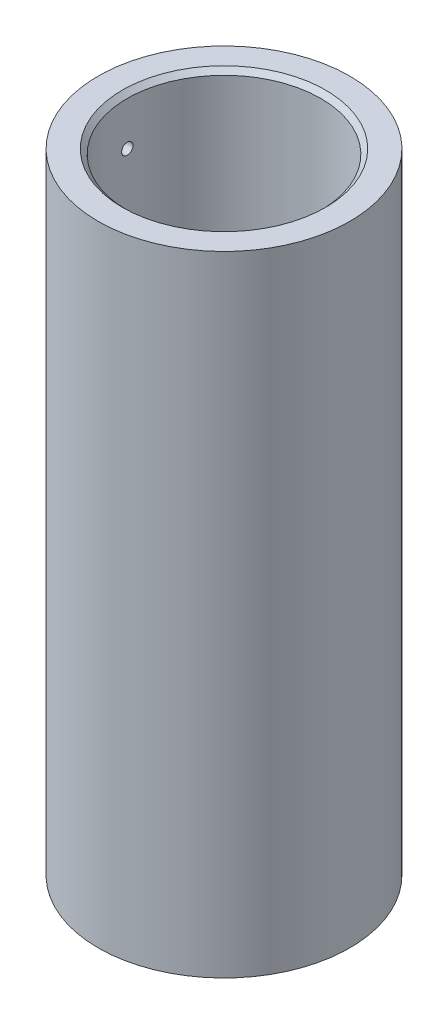
ISO-10303-21;
HEADER;
FILE_DESCRIPTION(('STEP AP214'),'2;1');
FILE_NAME('part.step','',(''),(''),'','','');
FILE_SCHEMA(('AUTOMOTIVE_DESIGN { 1 0 10303 214 1 1 1 1 }'));
ENDSEC;
DATA;
#1=APPLICATION_CONTEXT('core data for automotive mechanical design processes');
#2=APPLICATION_PROTOCOL_DEFINITION('international standard','automotive_design',2000,#1);
#3=PRODUCT_CONTEXT('',#1,'mechanical');
#4=PRODUCT('Part','Part','',(#3));
#5=PRODUCT_RELATED_PRODUCT_CATEGORY('part','',(#4));
#6=PRODUCT_DEFINITION_FORMATION('','',#4);
#7=PRODUCT_DEFINITION_CONTEXT('part definition',#1,'design');
#8=PRODUCT_DEFINITION('design','',#6,#7);
#9=PRODUCT_DEFINITION_SHAPE('','',#8);
#10=(LENGTH_UNIT() NAMED_UNIT(*) SI_UNIT(.MILLI.,.METRE.));
#11=(NAMED_UNIT(*) PLANE_ANGLE_UNIT() SI_UNIT($,.RADIAN.));
#12=(NAMED_UNIT(*) SI_UNIT($,.STERADIAN.) SOLID_ANGLE_UNIT());
#13=UNCERTAINTY_MEASURE_WITH_UNIT(LENGTH_MEASURE(1.E-05),#10,'distance_accuracy_value','');
#14=(GEOMETRIC_REPRESENTATION_CONTEXT(3) GLOBAL_UNCERTAINTY_ASSIGNED_CONTEXT((#13)) GLOBAL_UNIT_ASSIGNED_CONTEXT((#10,
#11,#12)) REPRESENTATION_CONTEXT('',''));
#15=CARTESIAN_POINT('',(0.,0.,0.));
#16=DIRECTION('',(0.,0.,1.));
#17=DIRECTION('',(1.,0.,0.));
#18=AXIS2_PLACEMENT_3D('',#15,#16,#17);
#19=CARTESIAN_POINT('',(0.,65.,0.));
#20=DIRECTION('',(0.,-1.,0.));
#21=DIRECTION('',(0.,0.,-1.));
#22=AXIS2_PLACEMENT_3D('',#19,#20,#21);
#23=CYLINDRICAL_SURFACE('',#22,13.);
#24=CARTESIAN_POINT('',(0.,65.,0.));
#25=DIRECTION('',(0.,1.,0.));
#26=DIRECTION('',(0.,0.,1.));
#27=AXIS2_PLACEMENT_3D('',#24,#25,#26);
#28=CIRCLE('',#27,13.);
#29=CARTESIAN_POINT('',(0.,65.,13.));
#30=VERTEX_POINT('',#29);
#31=EDGE_CURVE('E116',#30,#30,#28,.T.);
#32=ORIENTED_EDGE('',*,*,#31,.F.);
#33=EDGE_LOOP('',(#32));
#34=FACE_BOUND('',#33,.T.);
#35=CARTESIAN_POINT('',(0.,0.,0.));
#36=DIRECTION('',(0.,1.,0.));
#37=DIRECTION('',(0.,0.,1.));
#38=AXIS2_PLACEMENT_3D('',#35,#36,#37);
#39=CIRCLE('',#38,13.);
#40=CARTESIAN_POINT('',(0.,0.,13.));
#41=VERTEX_POINT('',#40);
#42=EDGE_CURVE('E71',#41,#41,#39,.T.);
#43=ORIENTED_EDGE('',*,*,#42,.T.);
#44=EDGE_LOOP('',(#43));
#45=FACE_BOUND('',#44,.T.);
#46=CARTESIAN_POINT('',(-12.9826052190465,59.3392387092506,-0.672281797011985));
#47=CARTESIAN_POINT('',(-12.984748886898,59.2960091721407,-0.630881430459776));
#48=CARTESIAN_POINT('',(-12.986909916261,59.2566726187457,-0.585299325584049));
#49=CARTESIAN_POINT('',(-12.9909521751454,59.1873786897514,-0.487398756726515));
#50=CARTESIAN_POINT('',(-12.9928329540857,59.1574363343137,-0.435069691745123));
#51=CARTESIAN_POINT('',(-12.995842561365,59.1111442011382,-0.332255636643755));
#52=CARTESIAN_POINT('',(-12.9970348033501,59.093588874855,-0.282312356670873));
#53=CARTESIAN_POINT('',(-12.9988512134006,59.0672302674987,-0.180191926650553));
#54=CARTESIAN_POINT('',(-12.9994758392139,59.0584199335904,-0.128016612224583));
#55=CARTESIAN_POINT('',(-13.0000821145129,59.049866262531,-0.0235968489868751));
#56=CARTESIAN_POINT('',(-13.000071853043,59.0500088572308,0.0286382530391472));
#57=CARTESIAN_POINT('',(-12.9994297794527,59.059072145411,0.132342683722056));
#58=CARTESIAN_POINT('',(-12.9987979097877,59.0679936515887,0.183811941033973));
#59=CARTESIAN_POINT('',(-12.9969869075833,59.0942944512943,0.284345877573625));
#60=CARTESIAN_POINT('',(-12.9958096014869,59.1116455270085,0.33341798228144));
#61=CARTESIAN_POINT('',(-12.993039448689,59.1542658270955,0.427978791938771));
#62=CARTESIAN_POINT('',(-12.9914465929942,59.1795352228377,0.473467419307547));
#63=CARTESIAN_POINT('',(-12.9880070713529,59.237473910249,0.559967369413155));
#64=CARTESIAN_POINT('',(-12.9861585078854,59.2701998339126,0.600940668060977));
#65=CARTESIAN_POINT('',(-12.9824211564049,59.341985828498,0.676897436562798));
#66=CARTESIAN_POINT('',(-12.9805323658362,59.3810463029295,0.711880524549636));
#67=CARTESIAN_POINT('',(-12.9768964381306,59.4649551708922,0.775361939128481));
#68=CARTESIAN_POINT('',(-12.9751515271372,59.5098738332754,0.803767519434379));
#69=CARTESIAN_POINT('',(-12.972025347655,59.6038103916964,0.852738511707706));
#70=CARTESIAN_POINT('',(-12.9706441019371,59.6528285441713,0.873303432766921));
#71=CARTESIAN_POINT('',(-12.9683849462962,59.7541604968562,0.906239237758916));
#72=CARTESIAN_POINT('',(-12.9675128036119,59.8065048806641,0.918516471625239));
#73=CARTESIAN_POINT('',(-12.9663937192655,59.9125141301852,0.934182226617728));
#74=CARTESIAN_POINT('',(-12.9661467993814,59.9661790418298,0.937570438117909));
#75=CARTESIAN_POINT('',(-12.9663062811821,60.0736118082706,0.935362349022701));
#76=CARTESIAN_POINT('',(-12.9667161904529,60.1273786740147,0.929717812135636));
#77=CARTESIAN_POINT('',(-12.9681496418824,60.2332003234051,0.909503290001022));
#78=CARTESIAN_POINT('',(-12.9691731924612,60.2852550835481,0.894933182279924));
#79=CARTESIAN_POINT('',(-12.97171773408,60.3861602623707,0.857259141025642));
#80=CARTESIAN_POINT('',(-12.9732386628092,60.4350110815161,0.834156276418472));
#81=CARTESIAN_POINT('',(-12.9766047772673,60.5281037411614,0.780038705166259));
#82=CARTESIAN_POINT('',(-12.9784499573952,60.5723456612544,0.749024135183669));
#83=CARTESIAN_POINT('',(-12.9822418147528,60.6546801142608,0.680130436612937));
#84=CARTESIAN_POINT('',(-12.9841878492142,60.6928064585135,0.642291695999673));
#85=CARTESIAN_POINT('',(-12.9879676987646,60.7620732566609,0.560678043420841));
#86=CARTESIAN_POINT('',(-12.9898015208197,60.793214144522,0.516903500483939));
#87=CARTESIAN_POINT('',(-12.9931245521981,60.847235445564,0.425196832267299));
#88=CARTESIAN_POINT('',(-12.994617514577,60.8702075475027,0.377318864757513));
#89=CARTESIAN_POINT('',(-12.9971140278697,60.907676603243,0.278342196006524));
#90=CARTESIAN_POINT('',(-12.9981176204354,60.922174278353,0.227243769287835));
#91=CARTESIAN_POINT('',(-12.9995096525294,60.9421015739563,0.124006384453683));
#92=CARTESIAN_POINT('',(-12.9999060920773,60.9476491762071,0.0718902879363762));
#93=CARTESIAN_POINT('',(-13.000064115705,60.9498722774745,-0.0325304797689752));
#94=CARTESIAN_POINT('',(-12.9998257314637,60.9465482192028,-0.0848351414172111));
#95=CARTESIAN_POINT('',(-12.9987450389048,60.9311860028407,-0.187778135906221));
#96=CARTESIAN_POINT('',(-12.9979068200459,60.9192068468139,-0.238425336671414));
#97=CARTESIAN_POINT('',(-12.9957248387833,60.8869691654905,-0.336999015964268));
#98=CARTESIAN_POINT('',(-12.9943810697892,60.8667105322599,-0.384925459013958));
#99=CARTESIAN_POINT('',(-12.9913298740764,60.818411639011,-0.476948552136245));
#100=CARTESIAN_POINT('',(-12.9896208061837,60.790336081741,-0.521026610144796));
#101=CARTESIAN_POINT('',(-12.9860314713562,60.7272703504657,-0.603912836290987));
#102=CARTESIAN_POINT('',(-12.984151193675,60.6922797422576,-0.642720673248021));
#103=CARTESIAN_POINT('',(-12.980401305209,60.6159087979467,-0.714487419975045));
#104=CARTESIAN_POINT('',(-12.9785321206729,60.5744541418139,-0.747367258629224));
#105=CARTESIAN_POINT('',(-12.9750351616416,60.4866619881795,-0.805805405531395));
#106=CARTESIAN_POINT('',(-12.9734074038586,60.4403241530339,-0.831363207047218));
#107=CARTESIAN_POINT('',(-12.9705540706945,60.343454629107,-0.874761977332898));
#108=CARTESIAN_POINT('',(-12.9693337811142,60.2928777287729,-0.892502413354063));
#109=CARTESIAN_POINT('',(-12.9674601145576,60.1894707598804,-0.919326060707889));
#110=CARTESIAN_POINT('',(-12.9668067310369,60.136640717339,-0.928409371976373));
#111=CARTESIAN_POINT('',(-12.9661371769876,60.0298215704677,-0.937715028054261));
#112=CARTESIAN_POINT('',(-12.9661255801365,59.975826889543,-0.937873772272528));
#113=CARTESIAN_POINT('',(-12.9667527240928,59.8685533925895,-0.92916207568068));
#114=CARTESIAN_POINT('',(-12.9673917022578,59.8152748450249,-0.920288339435559));
#115=CARTESIAN_POINT('',(-12.9692499133937,59.7108549475514,-0.893718743423222));
#116=CARTESIAN_POINT('',(-12.970470430786,59.6597186023527,-0.876003351327462));
#117=CARTESIAN_POINT('',(-12.9733522276785,59.5612330782097,-0.83223138393686));
#118=CARTESIAN_POINT('',(-12.9750127714517,59.5138777477987,-0.806188717017536));
#119=CARTESIAN_POINT('',(-12.9777183585392,59.4459873297297,-0.760961395619876));
#120=CARTESIAN_POINT('',(-12.978672720714,59.4235566753345,-0.744550546743418));
#121=CARTESIAN_POINT('',(-12.980618540075,59.3802169144847,-0.709821222200196));
#122=CARTESIAN_POINT('',(-12.9816100085666,59.3593082775585,-0.69150216206884));
#123=CARTESIAN_POINT('',(-12.9826052190465,59.3392387092506,-0.672281797011985));
#124=B_SPLINE_CURVE_WITH_KNOTS('',3,(#46,#47,#48,#49,#50,#51,#52,#53,#54,#55,#56,#57,#58,#59,
#60,#61,#62,#63,#64,#65,#66,#67,#68,#69,#70,#71,#72,#73,#74,#75,#76,#77,#78,#79,#80,#81,#82,#83,
#84,#85,#86,#87,#88,#89,#90,#91,#92,#93,#94,#95,#96,#97,#98,#99,#100,#101,#102,#103,#104,#105,
#106,#107,#108,#109,#110,#111,#112,#113,#114,#115,#116,#117,#118,#119,#120,#121,#122,#123),
.UNSPECIFIED.,.T.,.F.,(4,2,2,2,2,2,2,2,2,2,2,2,2,2,2,2,2,2,2,2,2,2,2,2,2,2,2,2,2,2,2,2,2,2,2,2,
2,2,4),(0.,0.179553836643895,0.35939331166161,0.517493941400255,0.675466959147728,
0.831427675870615,0.987402831830976,1.14285942464325,1.29831938209936,1.45500191962554,
1.61169444171861,1.77047754057811,1.92927057930739,2.0898292026303,2.25039341852119,
2.41181793759715,2.57324467173333,2.73465119027647,2.89605492096084,3.05653300895992,
3.21700112461113,3.37560658455245,3.53419854268244,3.6906823031663,3.84715825497877,
4.00257745036305,4.15799867190783,4.3141334077248,4.4702779505105,4.62837191393109,
4.78647681583149,4.94655952250094,5.1066403811907,5.26786190654335,5.42914227349105,
5.59078051662189,5.7521501863656,5.83548351752025,5.91884244825103),.UNSPECIFIED.);
#125=CARTESIAN_POINT('',(-12.9826052190465,59.3392387092506,-0.672281797011985));
#126=VERTEX_POINT('',#125);
#127=EDGE_CURVE('E10',#126,#126,#124,.T.);
#128=ORIENTED_EDGE('',*,*,#127,.F.);
#129=EDGE_LOOP('',(#128));
#130=FACE_BOUND('',#129,.T.);
#131=ADVANCED_FACE('F39',(#34,#45,#130),#23,.T.);
#132=CARTESIAN_POINT('',(0.,65.,0.));
#133=DIRECTION('',(0.,-1.,0.));
#134=DIRECTION('',(0.,0.,-1.));
#135=AXIS2_PLACEMENT_3D('',#132,#133,#134);
#136=CYLINDRICAL_SURFACE('',#135,10.);
#137=CARTESIAN_POINT('',(0.,64.5,0.));
#138=DIRECTION('',(0.,1.,0.));
#139=DIRECTION('',(0.,0.,1.));
#140=AXIS2_PLACEMENT_3D('',#137,#138,#139);
#141=CIRCLE('',#140,10.);
#142=CARTESIAN_POINT('',(0.,64.5,10.));
#143=VERTEX_POINT('',#142);
#144=EDGE_CURVE('E61',#143,#143,#141,.T.);
#145=ORIENTED_EDGE('',*,*,#144,.T.);
#146=EDGE_LOOP('',(#145));
#147=FACE_BOUND('',#146,.T.);
#148=CARTESIAN_POINT('',(0.,0.5,0.));
#149=DIRECTION('',(0.,1.,0.));
#150=DIRECTION('',(0.,0.,1.));
#151=AXIS2_PLACEMENT_3D('',#148,#149,#150);
#152=CIRCLE('',#151,10.);
#153=CARTESIAN_POINT('',(0.,0.5,10.));
#154=VERTEX_POINT('',#153);
#155=EDGE_CURVE('E56',#154,#154,#152,.F.);
#156=ORIENTED_EDGE('',*,*,#155,.T.);
#157=EDGE_LOOP('',(#156));
#158=FACE_BOUND('',#157,.T.);
#159=CARTESIAN_POINT('',(-9.98287408515203,60.,0.584999999999999));
#160=CARTESIAN_POINT('',(-9.98287431459036,60.0328295286354,0.584998553909893));
#161=CARTESIAN_POINT('',(-9.98303777040496,60.0656821459769,0.582227181745552));
#162=CARTESIAN_POINT('',(-9.98367402196258,60.1304805315211,0.571211246657749));
#163=CARTESIAN_POINT('',(-9.98414717927688,60.1624251941609,0.562960286242597));
#164=CARTESIAN_POINT('',(-9.98534905597184,60.2244596591283,0.541222719908999));
#165=CARTESIAN_POINT('',(-9.98607764202451,60.254550419535,0.527738845060737));
#166=CARTESIAN_POINT('',(-9.98770811206417,60.3120335102552,0.495922549382332));
#167=CARTESIAN_POINT('',(-9.98860995593499,60.3394264630031,0.477591250557093));
#168=CARTESIAN_POINT('',(-9.9904866888234,60.3907808666684,0.436573536030631));
#169=CARTESIAN_POINT('',(-9.99146166236894,60.4147382504609,0.413882031717638));
#170=CARTESIAN_POINT('',(-9.99337400669918,60.4585066858242,0.364798442710707));
#171=CARTESIAN_POINT('',(-9.99431137592575,60.4783175657298,0.338406204881957));
#172=CARTESIAN_POINT('',(-9.99604359274641,60.513242707423,0.282647919332397));
#173=CARTESIAN_POINT('',(-9.99683834006694,60.528353670258,0.253279801874377));
#174=CARTESIAN_POINT('',(-9.99819488118965,60.553428895198,0.19241794444694));
#175=CARTESIAN_POINT('',(-9.99875667723368,60.5633932068329,0.160924224936991));
#176=CARTESIAN_POINT('',(-9.99958343432883,60.5778811758326,0.0967437492497146));
#177=CARTESIAN_POINT('',(-9.99984873771771,60.5824111083113,0.0640584140830652));
#178=CARTESIAN_POINT('',(-10.0000537660669,60.5859211050951,-0.00160972220495593));
#179=CARTESIAN_POINT('',(-9.99999349431609,60.584901225462,-0.0345925203181265));
#180=CARTESIAN_POINT('',(-9.99955445048758,60.5773457350834,-0.0998768229465446));
#181=CARTESIAN_POINT('',(-9.99917606826591,60.5708168757578,-0.132179111802791));
#182=CARTESIAN_POINT('',(-9.99814385911912,60.5524392295248,-0.195228465912551));
#183=CARTESIAN_POINT('',(-9.99749003072769,60.5405904142967,-0.225975522885854));
#184=CARTESIAN_POINT('',(-9.99597988595788,60.5119015373304,-0.28506331338651));
#185=CARTESIAN_POINT('',(-9.99512344529032,60.4950584102999,-0.313402555318429));
#186=CARTESIAN_POINT('',(-9.9933044832266,60.4568612569873,-0.366853974993673));
#187=CARTESIAN_POINT('',(-9.99234196078969,60.435507186447,-0.391966121071181));
#188=CARTESIAN_POINT('',(-9.99041748180285,60.3888561665845,-0.438289902429147));
#189=CARTESIAN_POINT('',(-9.98945552826104,60.3635533581783,-0.459495637808255));
#190=CARTESIAN_POINT('',(-9.9876420807392,60.3097436627992,-0.497359169120628));
#191=CARTESIAN_POINT('',(-9.98679058679758,60.2812367747119,-0.514016963472016));
#192=CARTESIAN_POINT('',(-9.98529419638036,60.2218244405992,-0.542311306362076));
#193=CARTESIAN_POINT('',(-9.98464930975249,60.1909188803307,-0.553947615565961));
#194=CARTESIAN_POINT('',(-9.98363921850867,60.1275881781293,-0.571864648406909));
#195=CARTESIAN_POINT('',(-9.98327401101188,60.0951630518524,-0.578145427209049));
#196=CARTESIAN_POINT('',(-9.98286500074936,60.0297650878723,-0.585165778900617));
#197=CARTESIAN_POINT('',(-9.98282072254209,59.9967931329365,-0.585913548715269));
#198=CARTESIAN_POINT('',(-9.98305732244557,59.9311922466275,-0.581868063763505));
#199=CARTESIAN_POINT('',(-9.98333819907693,59.8985633136944,-0.577074834207517));
#200=CARTESIAN_POINT('',(-9.98419301999282,59.834597813287,-0.56209021807674));
#201=CARTESIAN_POINT('',(-9.9847667597497,59.8032603603626,-0.551902598612078));
#202=CARTESIAN_POINT('',(-9.9861424738461,59.7427400634824,-0.526422206282718));
#203=CARTESIAN_POINT('',(-9.98694444999851,59.7135572366431,-0.511129392867254));
#204=CARTESIAN_POINT('',(-9.98868741079794,59.6581369127489,-0.475851741493171));
#205=CARTESIAN_POINT('',(-9.98962855782261,59.6319029200415,-0.455861406429851));
#206=CARTESIAN_POINT('',(-9.9915432259138,59.5831602351387,-0.411764175053702));
#207=CARTESIAN_POINT('',(-9.99251674725932,59.5606515750584,-0.387657243256424));
#208=CARTESIAN_POINT('',(-9.99438784330951,59.5199708549681,-0.335975871919907));
#209=CARTESIAN_POINT('',(-9.99528532432354,59.50180409594,-0.308397255889279));
#210=CARTESIAN_POINT('',(-9.9969018606811,59.4703591271909,-0.250576410856628));
#211=CARTESIAN_POINT('',(-9.99762091701421,59.4570808903569,-0.220334196628724));
#212=CARTESIAN_POINT('',(-9.99879912917203,59.4357991240275,-0.158064188547713));
#213=CARTESIAN_POINT('',(-9.99925845089287,59.4277922271158,-0.126037548826603));
#214=CARTESIAN_POINT('',(-9.99986609582926,59.41726940429,-0.0610917240019344));
#215=CARTESIAN_POINT('',(-10.0000144216552,59.4147534322876,-0.0281725463922773));
#216=CARTESIAN_POINT('',(-9.99998336994718,59.4152843186535,0.0375713839029128));
#217=CARTESIAN_POINT('',(-9.99980448149802,59.4183228747058,0.0703962041845654));
#218=CARTESIAN_POINT('',(-9.99914009434794,59.4298593672654,0.135068761902976));
#219=CARTESIAN_POINT('',(-9.9986545950934,59.4383573136302,0.166916497575406));
#220=CARTESIAN_POINT('',(-9.99743157374539,59.460569540921,0.228732246099459));
#221=CARTESIAN_POINT('',(-9.99669405202441,59.4742838141371,0.258700261729279));
#222=CARTESIAN_POINT('',(-9.99504983975722,59.5065381670216,0.315909315210986));
#223=CARTESIAN_POINT('',(-9.99414315387546,59.5250781136351,0.343150428221156));
#224=CARTESIAN_POINT('',(-9.99226102962931,59.5664879680652,0.394174343014141));
#225=CARTESIAN_POINT('',(-9.9912854980326,59.5893638211264,0.417952316150623));
#226=CARTESIAN_POINT('',(-9.98937634650247,59.6387892090338,0.461338452100371));
#227=CARTESIAN_POINT('',(-9.98844273690338,59.6653396431999,0.480945591151027));
#228=CARTESIAN_POINT('',(-9.98672193023801,59.7213875959466,0.51544616075522));
#229=CARTESIAN_POINT('',(-9.98593490182331,59.750888449958,0.530334175286245));
#230=CARTESIAN_POINT('',(-9.98459855877625,59.8119540273134,0.55492768462071));
#231=CARTESIAN_POINT('',(-9.98404896505507,59.8435162770874,0.564639267136225));
#232=CARTESIAN_POINT('',(-9.98339417946431,59.8960605572483,0.576072088970622));
#233=CARTESIAN_POINT('',(-9.98320001170895,59.9167026952621,0.579415745217493));
#234=CARTESIAN_POINT('',(-9.98293989162764,59.9582267724542,0.583880159509366));
#235=CARTESIAN_POINT('',(-9.98287393914742,59.9791087113439,0.585000920229045));
#236=CARTESIAN_POINT('',(-9.98287408515203,60.,0.584999999999999));
#237=B_SPLINE_CURVE_WITH_KNOTS('',3,(#159,#160,#161,#162,#163,#164,#165,#166,#167,#168,#169,
#170,#171,#172,#173,#174,#175,#176,#177,#178,#179,#180,#181,#182,#183,#184,#185,#186,#187,#188,
#189,#190,#191,#192,#193,#194,#195,#196,#197,#198,#199,#200,#201,#202,#203,#204,#205,#206,#207,
#208,#209,#210,#211,#212,#213,#214,#215,#216,#217,#218,#219,#220,#221,#222,#223,#224,#225,#226,
#227,#228,#229,#230,#231,#232,#233,#234,#235,#236),.UNSPECIFIED.,.T.,.F.,(4,2,2,2,2,2,2,2,2,2,2,
2,2,2,2,2,2,2,2,2,2,2,2,2,2,2,2,2,2,2,2,2,2,2,2,2,2,2,4),(0.,0.0984123214071341,
0.196939742965554,0.295415811836858,0.393869106949352,0.49243800838073,0.59101098975651,
0.689653005866738,0.788294072657554,0.886821127978564,0.985347188024033,1.08375267650637,
1.18215868885427,1.28062522400835,1.37909272528968,1.47770774536229,1.57632279973539,
1.67494255379518,1.77356129200188,1.87203390129795,1.97050606256528,2.06890954744969,
2.16731381397559,2.26583381307937,2.36435466145372,2.46299518539784,2.56163516224928,
2.6602120650016,2.75878814034143,2.8572169951365,2.9556460276547,3.05407491469294,
3.15250108810877,3.25106320938839,3.34964949563731,3.44834852066422,3.54693121374278,
3.60955662364388,3.67218195819154),.UNSPECIFIED.);
#238=CARTESIAN_POINT('',(-9.98287408515203,60.,0.584999999999999));
#239=VERTEX_POINT('',#238);
#240=EDGE_CURVE('E64',#239,#239,#237,.T.);
#241=ORIENTED_EDGE('',*,*,#240,.T.);
#242=EDGE_LOOP('',(#241));
#243=FACE_BOUND('',#242,.T.);
#244=ADVANCED_FACE('F73',(#147,#158,#243),#136,.F.);
#245=CARTESIAN_POINT('',(0.,65.,0.));
#246=DIRECTION('',(0.,1.,0.));
#247=DIRECTION('',(0.,0.,1.));
#248=AXIS2_PLACEMENT_3D('',#245,#246,#247);
#249=PLANE('',#248);
#250=CARTESIAN_POINT('',(0.,65.,0.));
#251=DIRECTION('',(0.,1.,0.));
#252=DIRECTION('',(0.,0.,1.));
#253=AXIS2_PLACEMENT_3D('',#250,#251,#252);
#254=CIRCLE('',#253,10.5);
#255=CARTESIAN_POINT('',(0.,65.,10.5));
#256=VERTEX_POINT('',#255);
#257=EDGE_CURVE('E52',#256,#256,#254,.F.);
#258=ORIENTED_EDGE('',*,*,#257,.T.);
#259=EDGE_LOOP('',(#258));
#260=FACE_BOUND('',#259,.T.);
#261=ORIENTED_EDGE('',*,*,#31,.T.);
#262=EDGE_LOOP('',(#261));
#263=FACE_BOUND('',#262,.T.);
#264=ADVANCED_FACE('F95',(#260,#263),#249,.T.);
#265=CARTESIAN_POINT('',(0.,0.,0.));
#266=DIRECTION('',(0.,1.,0.));
#267=DIRECTION('',(0.,0.,1.));
#268=AXIS2_PLACEMENT_3D('',#265,#266,#267);
#269=PLANE('',#268);
#270=CARTESIAN_POINT('',(0.,0.,0.));
#271=DIRECTION('',(0.,1.,0.));
#272=DIRECTION('',(0.,0.,1.));
#273=AXIS2_PLACEMENT_3D('',#270,#271,#272);
#274=CIRCLE('',#273,10.5);
#275=CARTESIAN_POINT('',(0.,0.,10.5));
#276=VERTEX_POINT('',#275);
#277=EDGE_CURVE('E115',#276,#276,#274,.T.);
#278=ORIENTED_EDGE('',*,*,#277,.T.);
#279=EDGE_LOOP('',(#278));
#280=FACE_BOUND('',#279,.T.);
#281=ORIENTED_EDGE('',*,*,#42,.F.);
#282=EDGE_LOOP('',(#281));
#283=FACE_BOUND('',#282,.T.);
#284=ADVANCED_FACE('F101',(#280,#283),#269,.F.);
#285=CARTESIAN_POINT('',(0.,0.,0.));
#286=DIRECTION('',(0.,-1.,0.));
#287=DIRECTION('',(0.,0.,-1.));
#288=AXIS2_PLACEMENT_3D('',#285,#286,#287);
#289=CONICAL_SURFACE('',#288,10.5,0.78539816339745);
#290=ORIENTED_EDGE('',*,*,#155,.F.);
#291=EDGE_LOOP('',(#290));
#292=FACE_BOUND('',#291,.T.);
#293=ORIENTED_EDGE('',*,*,#277,.F.);
#294=EDGE_LOOP('',(#293));
#295=FACE_BOUND('',#294,.T.);
#296=ADVANCED_FACE('F88',(#292,#295),#289,.F.);
#297=CARTESIAN_POINT('',(0.,64.5,0.));
#298=DIRECTION('',(0.,1.,0.));
#299=DIRECTION('',(0.,0.,1.));
#300=AXIS2_PLACEMENT_3D('',#297,#298,#299);
#301=CONICAL_SURFACE('',#300,10.,0.785398163397457);
#302=ORIENTED_EDGE('',*,*,#257,.F.);
#303=EDGE_LOOP('',(#302));
#304=FACE_BOUND('',#303,.T.);
#305=ORIENTED_EDGE('',*,*,#144,.F.);
#306=EDGE_LOOP('',(#305));
#307=FACE_BOUND('',#306,.T.);
#308=ADVANCED_FACE('F42',(#304,#307),#301,.F.);
#309=CARTESIAN_POINT('',(-12.,60.,0.));
#310=DIRECTION('',(-1.,0.,0.));
#311=DIRECTION('',(0.,0.,1.));
#312=AXIS2_PLACEMENT_3D('',#309,#310,#311);
#313=CONICAL_SURFACE('',#312,0.585000000000002,0.349065850398865);
#314=CARTESIAN_POINT('',(-12.,60.,0.));
#315=DIRECTION('',(-1.,0.,0.));
#316=DIRECTION('',(0.,0.,1.));
#317=AXIS2_PLACEMENT_3D('',#314,#315,#316);
#318=CIRCLE('',#317,0.585000000000002);
#319=CARTESIAN_POINT('',(-12.,60.,0.585000000000002));
#320=VERTEX_POINT('',#319);
#321=EDGE_CURVE('E72',#320,#320,#318,.T.);
#322=ORIENTED_EDGE('',*,*,#321,.F.);
#323=EDGE_LOOP('',(#322));
#324=FACE_BOUND('',#323,.T.);
#325=ORIENTED_EDGE('',*,*,#127,.T.);
#326=EDGE_LOOP('',(#325));
#327=FACE_BOUND('',#326,.T.);
#328=ADVANCED_FACE('F79',(#324,#327),#313,.F.);
#329=CARTESIAN_POINT('',(-13.,60.,0.));
#330=DIRECTION('',(-1.,0.,0.));
#331=DIRECTION('',(0.,0.,1.));
#332=AXIS2_PLACEMENT_3D('',#329,#330,#331);
#333=CYLINDRICAL_SURFACE('',#332,0.584999999999999);
#334=ORIENTED_EDGE('',*,*,#240,.F.);
#335=EDGE_LOOP('',(#334));
#336=FACE_BOUND('',#335,.T.);
#337=ORIENTED_EDGE('',*,*,#321,.T.);
#338=EDGE_LOOP('',(#337));
#339=FACE_BOUND('',#338,.T.);
#340=ADVANCED_FACE('F76',(#336,#339),#333,.F.);
#341=CLOSED_SHELL('',(#131,#244,#264,#284,#296,#308,#328,#340));
#342=MANIFOLD_SOLID_BREP('B2',#341);
#343=ADVANCED_BREP_SHAPE_REPRESENTATION('',(#18,#342),#14);
#344=SHAPE_DEFINITION_REPRESENTATION(#9,#343);
ENDSEC;
END-ISO-10303-21;
